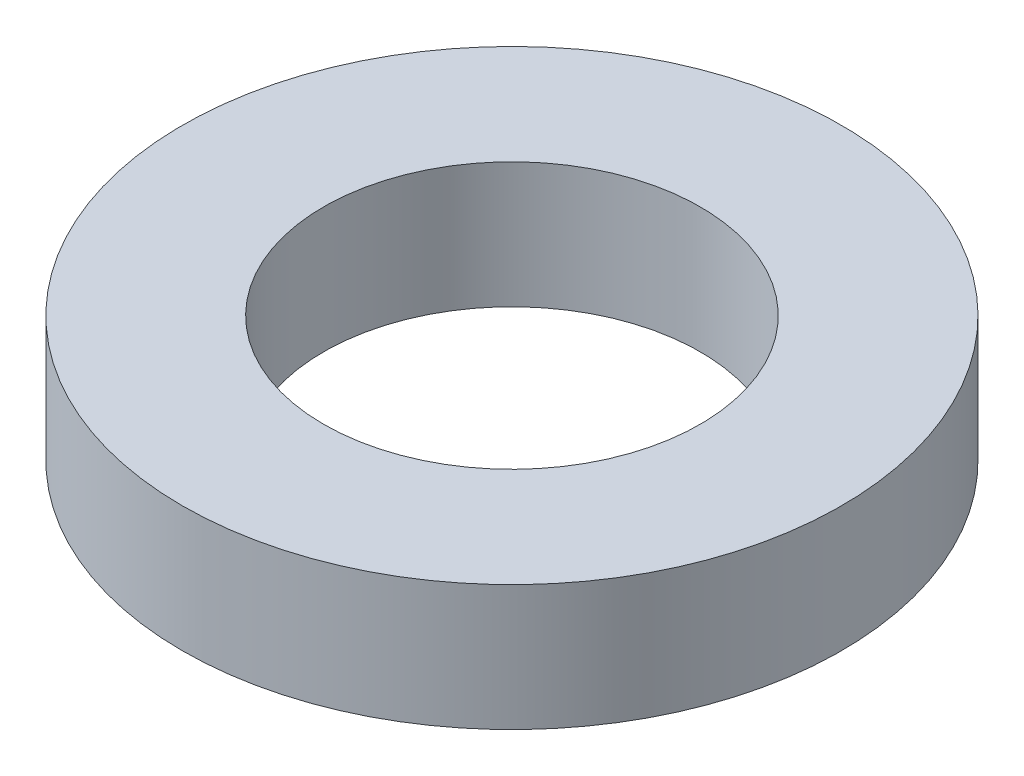
ISO-10303-21;
HEADER;
FILE_DESCRIPTION(('STEP AP214'),'2;1');
FILE_NAME('part.step','',(''),(''),'','','');
FILE_SCHEMA(('AUTOMOTIVE_DESIGN { 1 0 10303 214 1 1 1 1 }'));
ENDSEC;
DATA;
#1=APPLICATION_CONTEXT('core data for automotive mechanical design processes');
#2=APPLICATION_PROTOCOL_DEFINITION('international standard','automotive_design',2000,#1);
#3=PRODUCT_CONTEXT('',#1,'mechanical');
#4=PRODUCT('Part','Part','',(#3));
#5=PRODUCT_RELATED_PRODUCT_CATEGORY('part','',(#4));
#6=PRODUCT_DEFINITION_FORMATION('','',#4);
#7=PRODUCT_DEFINITION_CONTEXT('part definition',#1,'design');
#8=PRODUCT_DEFINITION('design','',#6,#7);
#9=PRODUCT_DEFINITION_SHAPE('','',#8);
#10=(LENGTH_UNIT() NAMED_UNIT(*) SI_UNIT(.MILLI.,.METRE.));
#11=(NAMED_UNIT(*) PLANE_ANGLE_UNIT() SI_UNIT($,.RADIAN.));
#12=(NAMED_UNIT(*) SI_UNIT($,.STERADIAN.) SOLID_ANGLE_UNIT());
#13=UNCERTAINTY_MEASURE_WITH_UNIT(LENGTH_MEASURE(1.E-05),#10,'distance_accuracy_value','');
#14=(GEOMETRIC_REPRESENTATION_CONTEXT(3) GLOBAL_UNCERTAINTY_ASSIGNED_CONTEXT((#13)) GLOBAL_UNIT_ASSIGNED_CONTEXT((#10,
#11,#12)) REPRESENTATION_CONTEXT('',''));
#15=CARTESIAN_POINT('',(0.,0.,0.));
#16=DIRECTION('',(0.,0.,1.));
#17=DIRECTION('',(1.,0.,0.));
#18=AXIS2_PLACEMENT_3D('',#15,#16,#17);
#19=CARTESIAN_POINT('',(0.,0.,0.));
#20=DIRECTION('',(0.,1.,0.));
#21=DIRECTION('',(0.,0.,1.));
#22=AXIS2_PLACEMENT_3D('',#19,#20,#21);
#23=PLANE('',#22);
#24=CARTESIAN_POINT('',(0.,0.,0.));
#25=DIRECTION('',(0.,1.,0.));
#26=DIRECTION('',(0.,0.,1.));
#27=AXIS2_PLACEMENT_3D('',#24,#25,#26);
#28=CIRCLE('',#27,10.5);
#29=CARTESIAN_POINT('',(0.,0.,10.5));
#30=VERTEX_POINT('',#29);
#31=EDGE_CURVE('E10',#30,#30,#28,.T.);
#32=ORIENTED_EDGE('',*,*,#31,.F.);
#33=EDGE_LOOP('',(#32));
#34=FACE_BOUND('',#33,.T.);
#35=CARTESIAN_POINT('',(0.,0.,0.));
#36=DIRECTION('',(0.,1.,0.));
#37=DIRECTION('',(0.,0.,1.));
#38=AXIS2_PLACEMENT_3D('',#35,#36,#37);
#39=CIRCLE('',#38,6.);
#40=CARTESIAN_POINT('',(0.,0.,6.));
#41=VERTEX_POINT('',#40);
#42=EDGE_CURVE('E38',#41,#41,#39,.T.);
#43=ORIENTED_EDGE('',*,*,#42,.T.);
#44=EDGE_LOOP('',(#43));
#45=FACE_BOUND('',#44,.T.);
#46=ADVANCED_FACE('F31',(#34,#45),#23,.F.);
#47=CARTESIAN_POINT('',(0.,2.,0.));
#48=DIRECTION('',(0.,-1.,0.));
#49=DIRECTION('',(0.,0.,-1.));
#50=AXIS2_PLACEMENT_3D('',#47,#48,#49);
#51=CYLINDRICAL_SURFACE('',#50,10.5);
#52=ORIENTED_EDGE('',*,*,#31,.T.);
#53=EDGE_LOOP('',(#52));
#54=FACE_BOUND('',#53,.T.);
#55=CARTESIAN_POINT('',(0.,4.,0.));
#56=DIRECTION('',(0.,1.,0.));
#57=DIRECTION('',(0.,0.,1.));
#58=AXIS2_PLACEMENT_3D('',#55,#56,#57);
#59=CIRCLE('',#58,10.5);
#60=CARTESIAN_POINT('',(0.,4.,10.5));
#61=VERTEX_POINT('',#60);
#62=EDGE_CURVE('E42',#61,#61,#59,.T.);
#63=ORIENTED_EDGE('',*,*,#62,.F.);
#64=EDGE_LOOP('',(#63));
#65=FACE_BOUND('',#64,.T.);
#66=ADVANCED_FACE('F33',(#54,#65),#51,.T.);
#67=CARTESIAN_POINT('',(0.,2.,0.));
#68=DIRECTION('',(0.,-1.,0.));
#69=DIRECTION('',(0.,0.,-1.));
#70=AXIS2_PLACEMENT_3D('',#67,#68,#69);
#71=CYLINDRICAL_SURFACE('',#70,6.);
#72=ORIENTED_EDGE('',*,*,#42,.F.);
#73=EDGE_LOOP('',(#72));
#74=FACE_BOUND('',#73,.T.);
#75=CARTESIAN_POINT('',(0.,4.,0.));
#76=DIRECTION('',(0.,1.,0.));
#77=DIRECTION('',(0.,0.,1.));
#78=AXIS2_PLACEMENT_3D('',#75,#76,#77);
#79=CIRCLE('',#78,6.);
#80=CARTESIAN_POINT('',(0.,4.,6.));
#81=VERTEX_POINT('',#80);
#82=EDGE_CURVE('E46',#81,#81,#79,.T.);
#83=ORIENTED_EDGE('',*,*,#82,.T.);
#84=EDGE_LOOP('',(#83));
#85=FACE_BOUND('',#84,.T.);
#86=ADVANCED_FACE('F52',(#74,#85),#71,.F.);
#87=CARTESIAN_POINT('',(0.,4.,0.));
#88=DIRECTION('',(0.,1.,0.));
#89=DIRECTION('',(0.,0.,1.));
#90=AXIS2_PLACEMENT_3D('',#87,#88,#89);
#91=PLANE('',#90);
#92=ORIENTED_EDGE('',*,*,#62,.T.);
#93=EDGE_LOOP('',(#92));
#94=FACE_BOUND('',#93,.T.);
#95=ORIENTED_EDGE('',*,*,#82,.F.);
#96=EDGE_LOOP('',(#95));
#97=FACE_BOUND('',#96,.T.);
#98=ADVANCED_FACE('F54',(#94,#97),#91,.T.);
#99=CLOSED_SHELL('',(#46,#66,#86,#98));
#100=MANIFOLD_SOLID_BREP('B2',#99);
#101=ADVANCED_BREP_SHAPE_REPRESENTATION('',(#18,#100),#14);
#102=SHAPE_DEFINITION_REPRESENTATION(#9,#101);
ENDSEC;
END-ISO-10303-21;
